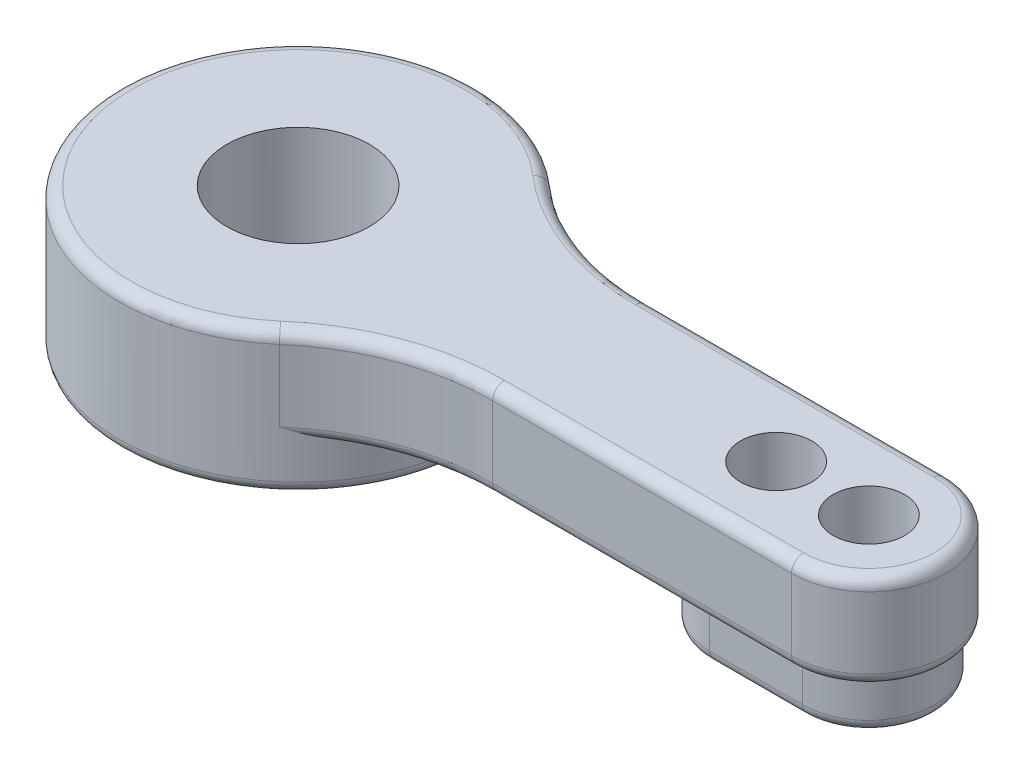
ISO-10303-21;
HEADER;
FILE_DESCRIPTION(('STEP AP214'),'2;1');
FILE_NAME('part.step','',(''),(''),'','','');
FILE_SCHEMA(('AUTOMOTIVE_DESIGN { 1 0 10303 214 1 1 1 1 }'));
ENDSEC;
DATA;
#1=APPLICATION_CONTEXT('core data for automotive mechanical design processes');
#2=APPLICATION_PROTOCOL_DEFINITION('international standard','automotive_design',2000,#1);
#3=PRODUCT_CONTEXT('',#1,'mechanical');
#4=PRODUCT('Part','Part','',(#3));
#5=PRODUCT_RELATED_PRODUCT_CATEGORY('part','',(#4));
#6=PRODUCT_DEFINITION_FORMATION('','',#4);
#7=PRODUCT_DEFINITION_CONTEXT('part definition',#1,'design');
#8=PRODUCT_DEFINITION('design','',#6,#7);
#9=PRODUCT_DEFINITION_SHAPE('','',#8);
#10=(LENGTH_UNIT() NAMED_UNIT(*) SI_UNIT(.MILLI.,.METRE.));
#11=(NAMED_UNIT(*) PLANE_ANGLE_UNIT() SI_UNIT($,.RADIAN.));
#12=(NAMED_UNIT(*) SI_UNIT($,.STERADIAN.) SOLID_ANGLE_UNIT());
#13=UNCERTAINTY_MEASURE_WITH_UNIT(LENGTH_MEASURE(1.E-05),#10,'distance_accuracy_value','');
#14=(GEOMETRIC_REPRESENTATION_CONTEXT(3) GLOBAL_UNCERTAINTY_ASSIGNED_CONTEXT((#13)) GLOBAL_UNIT_ASSIGNED_CONTEXT((#10,
#11,#12)) REPRESENTATION_CONTEXT('',''));
#15=CARTESIAN_POINT('',(0.,0.,0.));
#16=DIRECTION('',(0.,0.,1.));
#17=DIRECTION('',(1.,0.,0.));
#18=AXIS2_PLACEMENT_3D('',#15,#16,#17);
#19=CARTESIAN_POINT('',(0.,2.,0.));
#20=DIRECTION('',(0.,1.,0.));
#21=DIRECTION('',(0.,0.,1.));
#22=AXIS2_PLACEMENT_3D('',#19,#20,#21);
#23=PLANE('',#22);
#24=CARTESIAN_POINT('',(11.4318633651737,2.,-13.25));
#25=DIRECTION('',(0.,1.,0.));
#26=DIRECTION('',(0.,0.,1.));
#27=AXIS2_PLACEMENT_3D('',#24,#25,#26);
#28=CIRCLE('',#27,10.5);
#29=CARTESIAN_POINT('',(6.27940030121434,2.,-4.10111348990847));
#30=VERTEX_POINT('',#29);
#31=CARTESIAN_POINT('',(11.4318633651737,2.,-2.75));
#32=VERTEX_POINT('',#31);
#33=EDGE_CURVE('E223',#30,#32,#28,.T.);
#34=ORIENTED_EDGE('',*,*,#33,.T.);
#35=DIRECTION('',(-1.,0.,0.));
#36=VECTOR('',#35,1.);
#37=CARTESIAN_POINT('',(24.,2.,-2.75));
#38=LINE('',#37,#36);
#39=CARTESIAN_POINT('',(19.5732173123574,2.,-2.75));
#40=VERTEX_POINT('',#39);
#41=EDGE_CURVE('E180',#32,#40,#38,.F.);
#42=ORIENTED_EDGE('',*,*,#41,.T.);
#43=CARTESIAN_POINT('',(20.1,2.,0.));
#44=DIRECTION('',(0.,-1.,0.));
#45=DIRECTION('',(0.,0.,-1.));
#46=AXIS2_PLACEMENT_3D('',#43,#44,#45);
#47=CIRCLE('',#46,2.8);
#48=CARTESIAN_POINT('',(19.5732173123574,2.,2.75));
#49=VERTEX_POINT('',#48);
#50=EDGE_CURVE('E387',#49,#40,#47,.T.);
#51=ORIENTED_EDGE('',*,*,#50,.F.);
#52=DIRECTION('',(1.,0.,0.));
#53=VECTOR('',#52,1.);
#54=CARTESIAN_POINT('',(11.4318633651737,2.,2.75));
#55=LINE('',#54,#53);
#56=CARTESIAN_POINT('',(11.4318633651737,2.,2.75));
#57=VERTEX_POINT('',#56);
#58=EDGE_CURVE('E221',#49,#57,#55,.F.);
#59=ORIENTED_EDGE('',*,*,#58,.T.);
#60=CARTESIAN_POINT('',(11.4318633651737,2.,13.25));
#61=DIRECTION('',(0.,1.,0.));
#62=DIRECTION('',(0.,0.,1.));
#63=AXIS2_PLACEMENT_3D('',#60,#61,#62);
#64=CIRCLE('',#63,10.5);
#65=CARTESIAN_POINT('',(6.27940030121434,2.,4.10111348990847));
#66=VERTEX_POINT('',#65);
#67=EDGE_CURVE('E205',#57,#66,#64,.T.);
#68=ORIENTED_EDGE('',*,*,#67,.T.);
#69=CARTESIAN_POINT('',(0.,2.,0.));
#70=DIRECTION('',(0.,1.,0.));
#71=DIRECTION('',(0.,0.,1.));
#72=AXIS2_PLACEMENT_3D('',#69,#70,#71);
#73=CIRCLE('',#72,7.5);
#74=EDGE_CURVE('E398',#66,#30,#73,.T.);
#75=ORIENTED_EDGE('',*,*,#74,.T.);
#76=EDGE_LOOP('',(#34,#42,#51,#59,#68,#75));
#77=FACE_BOUND('',#76,.T.);
#78=ADVANCED_FACE('F35',(#77),#23,.F.);
#79=CARTESIAN_POINT('',(0.,6.,0.));
#80=DIRECTION('',(0.,-1.,0.));
#81=DIRECTION('',(0.,0.,-1.));
#82=AXIS2_PLACEMENT_3D('',#79,#80,#81);
#83=CYLINDRICAL_SURFACE('',#82,7.5);
#84=CARTESIAN_POINT('',(0.,0.5,0.));
#85=DIRECTION('',(0.,1.,0.));
#86=DIRECTION('',(0.,0.,1.));
#87=AXIS2_PLACEMENT_3D('',#84,#85,#86);
#88=CIRCLE('',#87,7.5);
#89=CARTESIAN_POINT('',(0.,0.5,7.5));
#90=VERTEX_POINT('',#89);
#91=EDGE_CURVE('E263',#90,#90,#88,.T.);
#92=ORIENTED_EDGE('',*,*,#91,.T.);
#93=EDGE_LOOP('',(#92));
#94=FACE_BOUND('',#93,.T.);
#95=DIRECTION('',(0.,-1.,0.));
#96=VECTOR('',#95,1.);
#97=CARTESIAN_POINT('',(4.89937001364586,6.,5.67857142857143));
#98=LINE('',#97,#96);
#99=CARTESIAN_POINT('',(4.89937001364586,2.5,5.67857142857143));
#100=VERTEX_POINT('',#99);
#101=CARTESIAN_POINT('',(4.89937001364586,5.5,5.67857142857143));
#102=VERTEX_POINT('',#101);
#103=EDGE_CURVE('E215',#100,#102,#98,.F.);
#104=ORIENTED_EDGE('',*,*,#103,.T.);
#105=CARTESIAN_POINT('',(0.,5.5,0.));
#106=DIRECTION('',(0.,1.,0.));
#107=DIRECTION('',(0.,0.,1.));
#108=AXIS2_PLACEMENT_3D('',#105,#106,#107);
#109=CIRCLE('',#108,7.5);
#110=CARTESIAN_POINT('',(4.89937001364586,5.5,-5.67857142857143));
#111=VERTEX_POINT('',#110);
#112=EDGE_CURVE('E266',#102,#111,#109,.F.);
#113=ORIENTED_EDGE('',*,*,#112,.T.);
#114=DIRECTION('',(0.,-1.,0.));
#115=VECTOR('',#114,1.);
#116=CARTESIAN_POINT('',(4.89937001364586,6.,-5.67857142857143));
#117=LINE('',#116,#115);
#118=CARTESIAN_POINT('',(4.89937001364586,2.5,-5.67857142857143));
#119=VERTEX_POINT('',#118);
#120=EDGE_CURVE('E211',#111,#119,#117,.T.);
#121=ORIENTED_EDGE('',*,*,#120,.T.);
#122=CARTESIAN_POINT('',(6.27940030121434,2.,-4.10111348990847));
#123=CARTESIAN_POINT('',(6.25723377122052,2.00000782456114,-4.13505467755479));
#124=CARTESIAN_POINT('',(6.23479981914706,2.00104754024722,-4.16880219382619));
#125=CARTESIAN_POINT('',(6.18944923163053,2.00493505579493,-4.23584149444576));
#126=CARTESIAN_POINT('',(6.16653286527585,2.00778187221623,-4.26913351661725));
#127=CARTESIAN_POINT('',(6.09721381699083,2.0186341910087,-4.36811882215584));
#128=CARTESIAN_POINT('',(6.05013346294917,2.02895408772651,-4.43308616706142));
#129=CARTESIAN_POINT('',(5.95470042062543,2.05419953593821,-4.56046505660428));
#130=CARTESIAN_POINT('',(5.90635758043871,2.06909575422026,-4.62289009045097));
#131=CARTESIAN_POINT('',(5.80818784316596,2.10244838021266,-4.74564370735154));
#132=CARTESIAN_POINT('',(5.75835992831014,2.12090727929871,-4.80597078826463));
#133=CARTESIAN_POINT('',(5.64552802746641,2.16514619530997,-4.93834398126179));
#134=CARTESIAN_POINT('',(5.58216046845735,2.19162974593726,-5.00984333760254));
#135=CARTESIAN_POINT('',(5.45332639431899,2.24744273517653,-5.14978410148016));
#136=CARTESIAN_POINT('',(5.38785924609357,2.2767730376853,-5.21822457148387));
#137=CARTESIAN_POINT('',(5.18815081579567,2.36751572822771,-5.41930302563903));
#138=CARTESIAN_POINT('',(5.05070000162154,2.431638226703,-5.54758412211042));
#139=CARTESIAN_POINT('',(4.90562186567096,2.49717864971323,-5.67317292140947));
#140=CARTESIAN_POINT('',(4.90249703074354,2.49858934228894,-5.67587347820163));
#141=CARTESIAN_POINT('',(4.89937001364586,2.5,-5.67857142857143));
#142=B_SPLINE_CURVE_WITH_KNOTS('',3,(#122,#123,#124,#125,#126,#127,#128,#129,#130,#131,#132,
#133,#134,#135,#136,#137,#138,#139,#140,#141),.UNSPECIFIED.,.F.,.F.,(4,2,2,2,2,2,2,2,2,4),(0.,
0.121576259864598,0.243086413500453,0.485518045605545,0.726427068848828,0.967505173719165,
1.26478671263421,1.56215875061039,2.15736827350903,2.17046135092412),.UNSPECIFIED.);
#143=EDGE_CURVE('E45',#119,#30,#142,.F.);
#144=ORIENTED_EDGE('',*,*,#143,.T.);
#145=ORIENTED_EDGE('',*,*,#74,.F.);
#146=CARTESIAN_POINT('',(6.27940030121434,2.,4.10111348990847));
#147=CARTESIAN_POINT('',(6.25723377122052,2.00000782456114,4.13505467755479));
#148=CARTESIAN_POINT('',(6.23479981914706,2.00104754024722,4.16880219382619));
#149=CARTESIAN_POINT('',(6.18944923163053,2.00493505579493,4.23584149444576));
#150=CARTESIAN_POINT('',(6.16653286527585,2.00778187221623,4.26913351661725));
#151=CARTESIAN_POINT('',(6.09721381699083,2.0186341910087,4.36811882215584));
#152=CARTESIAN_POINT('',(6.05013346294917,2.02895408772651,4.43308616706142));
#153=CARTESIAN_POINT('',(5.95470042062543,2.05419953593821,4.56046505660428));
#154=CARTESIAN_POINT('',(5.90635758043871,2.06909575422026,4.62289009045097));
#155=CARTESIAN_POINT('',(5.80818784316596,2.10244838021266,4.74564370735154));
#156=CARTESIAN_POINT('',(5.75835992831014,2.12090727929871,4.80597078826463));
#157=CARTESIAN_POINT('',(5.64552802746641,2.16514619530997,4.93834398126179));
#158=CARTESIAN_POINT('',(5.58216046845735,2.19162974593726,5.00984333760254));
#159=CARTESIAN_POINT('',(5.45332639431899,2.24744273517653,5.14978410148016));
#160=CARTESIAN_POINT('',(5.38785924609357,2.2767730376853,5.21822457148387));
#161=CARTESIAN_POINT('',(5.18815081579567,2.36751572822771,5.41930302563903));
#162=CARTESIAN_POINT('',(5.05070000162154,2.431638226703,5.54758412211042));
#163=CARTESIAN_POINT('',(4.90562186567096,2.49717864971323,5.67317292140947));
#164=CARTESIAN_POINT('',(4.90249703074354,2.49858934228894,5.67587347820163));
#165=CARTESIAN_POINT('',(4.89937001364586,2.5,5.67857142857143));
#166=B_SPLINE_CURVE_WITH_KNOTS('',3,(#146,#147,#148,#149,#150,#151,#152,#153,#154,#155,#156,
#157,#158,#159,#160,#161,#162,#163,#164,#165),.UNSPECIFIED.,.F.,.F.,(4,2,2,2,2,2,2,2,2,4),(0.,
0.121576259864598,0.243086413500453,0.485518045605545,0.726427068848828,0.967505173719165,
1.26478671263421,1.56215875061039,2.15736827350903,2.17046135092412),.UNSPECIFIED.);
#167=EDGE_CURVE('E11',#66,#100,#166,.T.);
#168=ORIENTED_EDGE('',*,*,#167,.T.);
#169=EDGE_LOOP('',(#104,#113,#121,#144,#145,#168));
#170=FACE_BOUND('',#169,.T.);
#171=ADVANCED_FACE('F321',(#94,#170),#83,.T.);
#172=CARTESIAN_POINT('',(0.,6.,0.));
#173=DIRECTION('',(0.,1.,0.));
#174=DIRECTION('',(0.,0.,1.));
#175=AXIS2_PLACEMENT_3D('',#172,#173,#174);
#176=PLANE('',#175);
#177=DIRECTION('',(-1.,0.,0.));
#178=VECTOR('',#177,1.);
#179=CARTESIAN_POINT('',(0.,6.,-2.75));
#180=LINE('',#179,#178);
#181=CARTESIAN_POINT('',(24.,6.,-2.75));
#182=VERTEX_POINT('',#181);
#183=CARTESIAN_POINT('',(11.4318633651737,6.,-2.75));
#184=VERTEX_POINT('',#183);
#185=EDGE_CURVE('E256',#182,#184,#180,.T.);
#186=ORIENTED_EDGE('',*,*,#185,.T.);
#187=CARTESIAN_POINT('',(11.4318633651737,6.,-13.25));
#188=DIRECTION('',(0.,1.,0.));
#189=DIRECTION('',(0.,0.,1.));
#190=AXIS2_PLACEMENT_3D('',#187,#188,#189);
#191=CIRCLE('',#190,10.5);
#192=CARTESIAN_POINT('',(4.57274534606947,6.,-5.3));
#193=VERTEX_POINT('',#192);
#194=EDGE_CURVE('E261',#184,#193,#191,.F.);
#195=ORIENTED_EDGE('',*,*,#194,.T.);
#196=CARTESIAN_POINT('',(0.,6.,0.));
#197=DIRECTION('',(0.,1.,0.));
#198=DIRECTION('',(0.,0.,1.));
#199=AXIS2_PLACEMENT_3D('',#196,#197,#198);
#200=CIRCLE('',#199,7.);
#201=CARTESIAN_POINT('',(4.57274534606947,6.,5.3));
#202=VERTEX_POINT('',#201);
#203=EDGE_CURVE('E258',#193,#202,#200,.T.);
#204=ORIENTED_EDGE('',*,*,#203,.T.);
#205=CARTESIAN_POINT('',(11.4318633651737,6.,13.25));
#206=DIRECTION('',(0.,1.,0.));
#207=DIRECTION('',(0.,0.,1.));
#208=AXIS2_PLACEMENT_3D('',#205,#206,#207);
#209=CIRCLE('',#208,10.5);
#210=CARTESIAN_POINT('',(11.4318633651737,6.,2.75));
#211=VERTEX_POINT('',#210);
#212=EDGE_CURVE('E252',#202,#211,#209,.F.);
#213=ORIENTED_EDGE('',*,*,#212,.T.);
#214=DIRECTION('',(1.,0.,0.));
#215=VECTOR('',#214,1.);
#216=CARTESIAN_POINT('',(0.,6.,2.75));
#217=LINE('',#216,#215);
#218=CARTESIAN_POINT('',(24.,6.,2.75));
#219=VERTEX_POINT('',#218);
#220=EDGE_CURVE('E250',#211,#219,#217,.T.);
#221=ORIENTED_EDGE('',*,*,#220,.T.);
#222=CARTESIAN_POINT('',(24.,6.,0.));
#223=DIRECTION('',(0.,1.,0.));
#224=DIRECTION('',(0.,0.,1.));
#225=AXIS2_PLACEMENT_3D('',#222,#223,#224);
#226=CIRCLE('',#225,2.75);
#227=EDGE_CURVE('E254',#219,#182,#226,.T.);
#228=ORIENTED_EDGE('',*,*,#227,.T.);
#229=EDGE_LOOP('',(#186,#195,#204,#213,#221,#228));
#230=FACE_BOUND('',#229,.T.);
#231=CARTESIAN_POINT('',(24.,6.,0.));
#232=DIRECTION('',(0.,-1.,0.));
#233=DIRECTION('',(0.,0.,-1.));
#234=AXIS2_PLACEMENT_3D('',#231,#232,#233);
#235=CIRCLE('',#234,1.5);
#236=CARTESIAN_POINT('',(24.,6.,-1.5));
#237=VERTEX_POINT('',#236);
#238=EDGE_CURVE('E371',#237,#237,#235,.T.);
#239=ORIENTED_EDGE('',*,*,#238,.T.);
#240=EDGE_LOOP('',(#239));
#241=FACE_BOUND('',#240,.T.);
#242=CARTESIAN_POINT('',(20.1,6.,0.));
#243=DIRECTION('',(0.,-1.,0.));
#244=DIRECTION('',(0.,0.,-1.));
#245=AXIS2_PLACEMENT_3D('',#242,#243,#244);
#246=CIRCLE('',#245,1.5);
#247=CARTESIAN_POINT('',(20.1,6.,-1.5));
#248=VERTEX_POINT('',#247);
#249=EDGE_CURVE('E375',#248,#248,#246,.T.);
#250=ORIENTED_EDGE('',*,*,#249,.T.);
#251=EDGE_LOOP('',(#250));
#252=FACE_BOUND('',#251,.T.);
#253=CARTESIAN_POINT('',(0.,6.,0.));
#254=DIRECTION('',(0.,-1.,0.));
#255=DIRECTION('',(0.,0.,-1.));
#256=AXIS2_PLACEMENT_3D('',#253,#254,#255);
#257=CIRCLE('',#256,3.);
#258=CARTESIAN_POINT('',(0.,6.,-3.));
#259=VERTEX_POINT('',#258);
#260=EDGE_CURVE('E378',#259,#259,#257,.T.);
#261=ORIENTED_EDGE('',*,*,#260,.T.);
#262=EDGE_LOOP('',(#261));
#263=FACE_BOUND('',#262,.T.);
#264=ADVANCED_FACE('F325',(#230,#241,#252,#263),#176,.T.);
#265=CARTESIAN_POINT('',(0.,0.,0.));
#266=DIRECTION('',(0.,1.,0.));
#267=DIRECTION('',(0.,0.,1.));
#268=AXIS2_PLACEMENT_3D('',#265,#266,#267);
#269=PLANE('',#268);
#270=CARTESIAN_POINT('',(0.,0.,0.));
#271=DIRECTION('',(0.,1.,0.));
#272=DIRECTION('',(0.,0.,1.));
#273=AXIS2_PLACEMENT_3D('',#270,#271,#272);
#274=CIRCLE('',#273,7.);
#275=CARTESIAN_POINT('',(0.,0.,7.));
#276=VERTEX_POINT('',#275);
#277=EDGE_CURVE('E272',#276,#276,#274,.F.);
#278=ORIENTED_EDGE('',*,*,#277,.T.);
#279=EDGE_LOOP('',(#278));
#280=FACE_BOUND('',#279,.T.);
#281=CARTESIAN_POINT('',(0.,0.,0.));
#282=DIRECTION('',(0.,1.,0.));
#283=DIRECTION('',(0.,0.,1.));
#284=AXIS2_PLACEMENT_3D('',#281,#282,#283);
#285=CIRCLE('',#284,3.);
#286=CARTESIAN_POINT('',(0.,0.,3.));
#287=VERTEX_POINT('',#286);
#288=EDGE_CURVE('E390',#287,#287,#285,.T.);
#289=ORIENTED_EDGE('',*,*,#288,.T.);
#290=EDGE_LOOP('',(#289));
#291=FACE_BOUND('',#290,.T.);
#292=ADVANCED_FACE('F327',(#280,#291),#269,.F.);
#293=CARTESIAN_POINT('',(0.,2.,-3.25));
#294=DIRECTION('',(0.,0.,-1.));
#295=DIRECTION('',(-1.,0.,0.));
#296=AXIS2_PLACEMENT_3D('',#293,#294,#295);
#297=PLANE('',#296);
#298=DIRECTION('',(0.,1.,0.));
#299=VECTOR('',#298,1.);
#300=CARTESIAN_POINT('',(24.,2.,-3.25));
#301=LINE('',#300,#299);
#302=CARTESIAN_POINT('',(24.,2.5,-3.25));
#303=VERTEX_POINT('',#302);
#304=CARTESIAN_POINT('',(24.,5.5,-3.25));
#305=VERTEX_POINT('',#304);
#306=EDGE_CURVE('E203',#303,#305,#301,.T.);
#307=ORIENTED_EDGE('',*,*,#306,.F.);
#308=DIRECTION('',(-1.,0.,0.));
#309=VECTOR('',#308,1.);
#310=CARTESIAN_POINT('',(11.4318633651737,2.5,-3.25));
#311=LINE('',#310,#309);
#312=CARTESIAN_POINT('',(11.4318633651737,2.5,-3.25));
#313=VERTEX_POINT('',#312);
#314=EDGE_CURVE('E179',#303,#313,#311,.T.);
#315=ORIENTED_EDGE('',*,*,#314,.T.);
#316=DIRECTION('',(0.,-1.,0.));
#317=VECTOR('',#316,1.);
#318=CARTESIAN_POINT('',(11.4318633651737,2.,-3.25));
#319=LINE('',#318,#317);
#320=CARTESIAN_POINT('',(11.4318633651737,5.5,-3.25));
#321=VERTEX_POINT('',#320);
#322=EDGE_CURVE('E200',#313,#321,#319,.F.);
#323=ORIENTED_EDGE('',*,*,#322,.T.);
#324=DIRECTION('',(-1.,0.,0.));
#325=VECTOR('',#324,1.);
#326=CARTESIAN_POINT('',(0.,5.5,-3.25));
#327=LINE('',#326,#325);
#328=EDGE_CURVE('E206',#321,#305,#327,.F.);
#329=ORIENTED_EDGE('',*,*,#328,.T.);
#330=EDGE_LOOP('',(#307,#315,#323,#329));
#331=FACE_BOUND('',#330,.T.);
#332=ADVANCED_FACE('F199',(#331),#297,.T.);
#333=CARTESIAN_POINT('',(0.,2.,3.25));
#334=DIRECTION('',(0.,0.,1.));
#335=DIRECTION('',(1.,0.,0.));
#336=AXIS2_PLACEMENT_3D('',#333,#334,#335);
#337=PLANE('',#336);
#338=DIRECTION('',(0.,-1.,0.));
#339=VECTOR('',#338,1.);
#340=CARTESIAN_POINT('',(11.4318633651737,2.,3.25));
#341=LINE('',#340,#339);
#342=CARTESIAN_POINT('',(11.4318633651737,5.5,3.25));
#343=VERTEX_POINT('',#342);
#344=CARTESIAN_POINT('',(11.4318633651737,2.5,3.25));
#345=VERTEX_POINT('',#344);
#346=EDGE_CURVE('E210',#343,#345,#341,.T.);
#347=ORIENTED_EDGE('',*,*,#346,.T.);
#348=DIRECTION('',(1.,0.,0.));
#349=VECTOR('',#348,1.);
#350=CARTESIAN_POINT('',(24.,2.5,3.25));
#351=LINE('',#350,#349);
#352=CARTESIAN_POINT('',(24.,2.5,3.25));
#353=VERTEX_POINT('',#352);
#354=EDGE_CURVE('E228',#345,#353,#351,.T.);
#355=ORIENTED_EDGE('',*,*,#354,.T.);
#356=DIRECTION('',(0.,1.,0.));
#357=VECTOR('',#356,1.);
#358=CARTESIAN_POINT('',(24.,2.,3.25));
#359=LINE('',#358,#357);
#360=CARTESIAN_POINT('',(24.,5.5,3.25));
#361=VERTEX_POINT('',#360);
#362=EDGE_CURVE('E396',#353,#361,#359,.T.);
#363=ORIENTED_EDGE('',*,*,#362,.T.);
#364=DIRECTION('',(1.,0.,0.));
#365=VECTOR('',#364,1.);
#366=CARTESIAN_POINT('',(0.,5.5,3.25));
#367=LINE('',#366,#365);
#368=EDGE_CURVE('E226',#361,#343,#367,.F.);
#369=ORIENTED_EDGE('',*,*,#368,.T.);
#370=EDGE_LOOP('',(#347,#355,#363,#369));
#371=FACE_BOUND('',#370,.T.);
#372=ADVANCED_FACE('F352',(#371),#337,.T.);
#373=CARTESIAN_POINT('',(24.,2.,0.));
#374=DIRECTION('',(0.,1.,0.));
#375=DIRECTION('',(0.,0.,1.));
#376=AXIS2_PLACEMENT_3D('',#373,#374,#375);
#377=CYLINDRICAL_SURFACE('',#376,3.25);
#378=ORIENTED_EDGE('',*,*,#362,.F.);
#379=CARTESIAN_POINT('',(24.,2.5,0.));
#380=DIRECTION('',(0.,1.,0.));
#381=DIRECTION('',(0.,0.,1.));
#382=AXIS2_PLACEMENT_3D('',#379,#380,#381);
#383=CIRCLE('',#382,3.25);
#384=EDGE_CURVE('E232',#353,#303,#383,.T.);
#385=ORIENTED_EDGE('',*,*,#384,.T.);
#386=ORIENTED_EDGE('',*,*,#306,.T.);
#387=CARTESIAN_POINT('',(24.,5.5,0.));
#388=DIRECTION('',(0.,1.,0.));
#389=DIRECTION('',(0.,0.,1.));
#390=AXIS2_PLACEMENT_3D('',#387,#388,#389);
#391=CIRCLE('',#390,3.25);
#392=EDGE_CURVE('E230',#305,#361,#391,.F.);
#393=ORIENTED_EDGE('',*,*,#392,.T.);
#394=EDGE_LOOP('',(#378,#385,#386,#393));
#395=FACE_BOUND('',#394,.T.);
#396=ADVANCED_FACE('F353',(#395),#377,.T.);
#397=CARTESIAN_POINT('',(24.,0.,0.));
#398=DIRECTION('',(0.,1.,0.));
#399=DIRECTION('',(0.,0.,1.));
#400=AXIS2_PLACEMENT_3D('',#397,#398,#399);
#401=CYLINDRICAL_SURFACE('',#400,2.8);
#402=DIRECTION('',(0.,1.,0.));
#403=VECTOR('',#402,1.);
#404=CARTESIAN_POINT('',(24.,0.,2.8));
#405=LINE('',#404,#403);
#406=CARTESIAN_POINT('',(24.,0.5,2.8));
#407=VERTEX_POINT('',#406);
#408=CARTESIAN_POINT('',(24.,2.00250628144669,2.8));
#409=VERTEX_POINT('',#408);
#410=EDGE_CURVE('E394',#407,#409,#405,.T.);
#411=ORIENTED_EDGE('',*,*,#410,.F.);
#412=CARTESIAN_POINT('',(24.,0.5,0.));
#413=DIRECTION('',(0.,-1.,0.));
#414=DIRECTION('',(0.,0.,-1.));
#415=AXIS2_PLACEMENT_3D('',#412,#413,#414);
#416=CIRCLE('',#415,2.8);
#417=CARTESIAN_POINT('',(24.,0.5,-2.8));
#418=VERTEX_POINT('',#417);
#419=EDGE_CURVE('E246',#407,#418,#416,.F.);
#420=ORIENTED_EDGE('',*,*,#419,.T.);
#421=DIRECTION('',(0.,1.,0.));
#422=VECTOR('',#421,1.);
#423=CARTESIAN_POINT('',(24.,0.,-2.8));
#424=LINE('',#423,#422);
#425=CARTESIAN_POINT('',(24.,2.00250628144669,-2.8));
#426=VERTEX_POINT('',#425);
#427=EDGE_CURVE('E65',#418,#426,#424,.T.);
#428=ORIENTED_EDGE('',*,*,#427,.T.);
#429=CARTESIAN_POINT('',(24.,2.00250628144669,0.));
#430=DIRECTION('',(0.,1.,0.));
#431=DIRECTION('',(0.,0.,1.));
#432=AXIS2_PLACEMENT_3D('',#429,#430,#431);
#433=CIRCLE('',#432,2.8);
#434=EDGE_CURVE('E473',#426,#409,#433,.F.);
#435=ORIENTED_EDGE('',*,*,#434,.T.);
#436=EDGE_LOOP('',(#411,#420,#428,#435));
#437=FACE_BOUND('',#436,.T.);
#438=ADVANCED_FACE('F349',(#437),#401,.T.);
#439=CARTESIAN_POINT('',(24.,0.,2.8));
#440=DIRECTION('',(0.,0.,-1.));
#441=DIRECTION('',(-1.,0.,0.));
#442=AXIS2_PLACEMENT_3D('',#439,#440,#441);
#443=PLANE('',#442);
#444=DIRECTION('',(0.,1.,0.));
#445=VECTOR('',#444,1.);
#446=CARTESIAN_POINT('',(20.1,0.,2.8));
#447=LINE('',#446,#445);
#448=CARTESIAN_POINT('',(20.1,0.5,2.8));
#449=VERTEX_POINT('',#448);
#450=CARTESIAN_POINT('',(20.1,2.00250628144669,2.8));
#451=VERTEX_POINT('',#450);
#452=EDGE_CURVE('E53',#449,#451,#447,.T.);
#453=ORIENTED_EDGE('',*,*,#452,.F.);
#454=DIRECTION('',(-1.,0.,0.));
#455=VECTOR('',#454,1.);
#456=CARTESIAN_POINT('',(24.,0.5,2.8));
#457=LINE('',#456,#455);
#458=EDGE_CURVE('E243',#449,#407,#457,.F.);
#459=ORIENTED_EDGE('',*,*,#458,.T.);
#460=ORIENTED_EDGE('',*,*,#410,.T.);
#461=DIRECTION('',(-1.,0.,0.));
#462=VECTOR('',#461,1.);
#463=CARTESIAN_POINT('',(0.,2.00250628144669,2.8));
#464=LINE('',#463,#462);
#465=EDGE_CURVE('E474',#409,#451,#464,.T.);
#466=ORIENTED_EDGE('',*,*,#465,.T.);
#467=EDGE_LOOP('',(#453,#459,#460,#466));
#468=FACE_BOUND('',#467,.T.);
#469=ADVANCED_FACE('F677',(#468),#443,.F.);
#470=CARTESIAN_POINT('',(20.1,0.,0.));
#471=DIRECTION('',(0.,1.,0.));
#472=DIRECTION('',(0.,0.,1.));
#473=AXIS2_PLACEMENT_3D('',#470,#471,#472);
#474=CYLINDRICAL_SURFACE('',#473,2.8);
#475=DIRECTION('',(0.,1.,0.));
#476=VECTOR('',#475,1.);
#477=CARTESIAN_POINT('',(20.1,0.,-2.8));
#478=LINE('',#477,#476);
#479=CARTESIAN_POINT('',(20.1,0.5,-2.8));
#480=VERTEX_POINT('',#479);
#481=CARTESIAN_POINT('',(20.1,2.00250628144669,-2.8));
#482=VERTEX_POINT('',#481);
#483=EDGE_CURVE('E72',#480,#482,#478,.T.);
#484=ORIENTED_EDGE('',*,*,#483,.F.);
#485=CARTESIAN_POINT('',(20.1,0.5,0.));
#486=DIRECTION('',(0.,-1.,0.));
#487=DIRECTION('',(0.,0.,-1.));
#488=AXIS2_PLACEMENT_3D('',#485,#486,#487);
#489=CIRCLE('',#488,2.8);
#490=EDGE_CURVE('E275',#480,#449,#489,.F.);
#491=ORIENTED_EDGE('',*,*,#490,.T.);
#492=ORIENTED_EDGE('',*,*,#452,.T.);
#493=CARTESIAN_POINT('',(20.1,2.00250628144669,2.8));
#494=CARTESIAN_POINT('',(20.0605273098205,2.00251320547436,2.80000012031858));
#495=CARTESIAN_POINT('',(20.0210589691369,2.00242162093721,2.79916523370932));
#496=CARTESIAN_POINT('',(19.942195484784,2.00210048014614,2.79582820206988));
#497=CARTESIAN_POINT('',(19.9028003372984,2.0018709313005,2.79332614656114));
#498=CARTESIAN_POINT('',(19.7854038388822,2.00106790483025,2.78337314210275));
#499=CARTESIAN_POINT('',(19.7075986717161,2.00037837454436,2.77347508934333));
#500=CARTESIAN_POINT('',(19.5530784452561,1.99983503729572,2.74718361423967));
#501=CARTESIAN_POINT('',(19.476363431827,1.99998126539119,2.73078991944443));
#502=CARTESIAN_POINT('',(19.3622920456543,2.00227446052725,2.70135986058976));
#503=CARTESIAN_POINT('',(19.3242950515098,2.00339261121849,2.69069423149586));
#504=CARTESIAN_POINT('',(19.2488144187992,2.00667306944443,2.66777823793601));
#505=CARTESIAN_POINT('',(19.2113309681647,2.00883574925505,2.65552730960119));
#506=CARTESIAN_POINT('',(19.174156686257,2.01169264625592,2.64250149638507));
#507=B_SPLINE_CURVE_WITH_KNOTS('',3,(#493,#494,#495,#496,#497,#498,#499,#500,#501,#502,#503,
#504,#505,#506),.UNSPECIFIED.,.F.,.F.,(4,2,2,2,2,2,4),(0.,0.118400552395828,0.236794747587691,
0.471810676962812,0.706836464809551,0.825237394891478,0.943680554891164),.UNSPECIFIED.);
#508=EDGE_CURVE('E310',#451,#49,#507,.T.);
#509=ORIENTED_EDGE('',*,*,#508,.T.);
#510=ORIENTED_EDGE('',*,*,#50,.T.);
#511=CARTESIAN_POINT('',(19.5732173123574,2.,-2.75));
#512=CARTESIAN_POINT('',(19.6119650912237,2.00000624673782,-2.7574224493602));
#513=CARTESIAN_POINT('',(19.6508646545702,2.00016443845236,-2.76402482810073));
#514=CARTESIAN_POINT('',(19.7289073082153,2.00062015591522,-2.77558038950895));
#515=CARTESIAN_POINT('',(19.7680503988317,2.00091768184539,-2.78053357002421));
#516=CARTESIAN_POINT('',(19.8851820879372,2.00176826697491,-2.79284551286858));
#517=CARTESIAN_POINT('',(19.9634404279816,2.00228422563194,-2.79776510020806));
#518=CARTESIAN_POINT('',(20.120097531168,2.00260735664962,-2.80102375034137));
#519=CARTESIAN_POINT('',(20.1984962969471,2.00241451555637,-2.79936268822624));
#520=CARTESIAN_POINT('',(20.3160417152819,2.00175682562131,-2.7919318756157));
#521=CARTESIAN_POINT('',(20.3553574104271,2.00147448674639,-2.78861057250213));
#522=CARTESIAN_POINT('',(20.4338130213326,2.00090337441478,-2.7803101669541));
#523=CARTESIAN_POINT('',(20.4729529386269,2.00061460101437,-2.77533107901531));
#524=CARTESIAN_POINT('',(20.5119748823308,2.00038142730687,-2.76952643900153));
#525=B_SPLINE_CURVE_WITH_KNOTS('',3,(#511,#512,#513,#514,#515,#516,#517,#518,#519,#520,#521,
#522,#523,#524),.UNSPECIFIED.,.F.,.F.,(4,2,2,2,2,2,4),(0.,0.118337945968026,0.236676046382285,
0.471625023229342,0.706578459723126,0.824917853956475,0.943256213457199),.UNSPECIFIED.);
#526=EDGE_CURVE('E277',#40,#482,#525,.T.);
#527=ORIENTED_EDGE('',*,*,#526,.T.);
#528=EDGE_LOOP('',(#484,#491,#492,#509,#510,#527));
#529=FACE_BOUND('',#528,.T.);
#530=ADVANCED_FACE('F287',(#529),#474,.T.);
#531=CARTESIAN_POINT('',(24.,0.,-2.8));
#532=DIRECTION('',(0.,0.,1.));
#533=DIRECTION('',(1.,0.,0.));
#534=AXIS2_PLACEMENT_3D('',#531,#532,#533);
#535=PLANE('',#534);
#536=ORIENTED_EDGE('',*,*,#427,.F.);
#537=DIRECTION('',(1.,0.,0.));
#538=VECTOR('',#537,1.);
#539=CARTESIAN_POINT('',(20.1,0.5,-2.8));
#540=LINE('',#539,#538);
#541=EDGE_CURVE('E248',#418,#480,#540,.F.);
#542=ORIENTED_EDGE('',*,*,#541,.T.);
#543=ORIENTED_EDGE('',*,*,#483,.T.);
#544=DIRECTION('',(1.,0.,0.));
#545=VECTOR('',#544,1.);
#546=CARTESIAN_POINT('',(0.,2.00250628144669,-2.8));
#547=LINE('',#546,#545);
#548=EDGE_CURVE('E285',#482,#426,#547,.T.);
#549=ORIENTED_EDGE('',*,*,#548,.T.);
#550=EDGE_LOOP('',(#536,#542,#543,#549));
#551=FACE_BOUND('',#550,.T.);
#552=ADVANCED_FACE('F469',(#551),#535,.F.);
#553=CARTESIAN_POINT('',(24.,0.,0.));
#554=DIRECTION('',(0.,-1.,0.));
#555=DIRECTION('',(0.,0.,-1.));
#556=AXIS2_PLACEMENT_3D('',#553,#554,#555);
#557=PLANE('',#556);
#558=CARTESIAN_POINT('',(24.,0.,0.));
#559=DIRECTION('',(0.,-1.,0.));
#560=DIRECTION('',(0.,0.,-1.));
#561=AXIS2_PLACEMENT_3D('',#558,#559,#560);
#562=CIRCLE('',#561,2.3);
#563=CARTESIAN_POINT('',(24.,0.,-2.3));
#564=VERTEX_POINT('',#563);
#565=CARTESIAN_POINT('',(24.,0.,2.3));
#566=VERTEX_POINT('',#565);
#567=EDGE_CURVE('E238',#564,#566,#562,.T.);
#568=ORIENTED_EDGE('',*,*,#567,.T.);
#569=DIRECTION('',(-1.,0.,0.));
#570=VECTOR('',#569,1.);
#571=CARTESIAN_POINT('',(20.1,0.,2.3));
#572=LINE('',#571,#570);
#573=CARTESIAN_POINT('',(20.1,0.,2.3));
#574=VERTEX_POINT('',#573);
#575=EDGE_CURVE('E240',#566,#574,#572,.T.);
#576=ORIENTED_EDGE('',*,*,#575,.T.);
#577=CARTESIAN_POINT('',(20.1,0.,0.));
#578=DIRECTION('',(0.,-1.,0.));
#579=DIRECTION('',(0.,0.,-1.));
#580=AXIS2_PLACEMENT_3D('',#577,#578,#579);
#581=CIRCLE('',#580,2.3);
#582=CARTESIAN_POINT('',(20.1,0.,-2.3));
#583=VERTEX_POINT('',#582);
#584=EDGE_CURVE('E234',#574,#583,#581,.T.);
#585=ORIENTED_EDGE('',*,*,#584,.T.);
#586=DIRECTION('',(1.,0.,0.));
#587=VECTOR('',#586,1.);
#588=CARTESIAN_POINT('',(24.,0.,-2.3));
#589=LINE('',#588,#587);
#590=EDGE_CURVE('E236',#583,#564,#589,.T.);
#591=ORIENTED_EDGE('',*,*,#590,.T.);
#592=EDGE_LOOP('',(#568,#576,#585,#591));
#593=FACE_BOUND('',#592,.T.);
#594=CARTESIAN_POINT('',(24.,0.,0.));
#595=DIRECTION('',(0.,-1.,0.));
#596=DIRECTION('',(0.,0.,-1.));
#597=AXIS2_PLACEMENT_3D('',#594,#595,#596);
#598=CIRCLE('',#597,1.5);
#599=CARTESIAN_POINT('',(24.,0.,-1.5));
#600=VERTEX_POINT('',#599);
#601=EDGE_CURVE('E406',#600,#600,#598,.T.);
#602=ORIENTED_EDGE('',*,*,#601,.F.);
#603=EDGE_LOOP('',(#602));
#604=FACE_BOUND('',#603,.T.);
#605=CARTESIAN_POINT('',(20.1,0.,0.));
#606=DIRECTION('',(0.,-1.,0.));
#607=DIRECTION('',(0.,0.,-1.));
#608=AXIS2_PLACEMENT_3D('',#605,#606,#607);
#609=CIRCLE('',#608,1.5);
#610=CARTESIAN_POINT('',(20.1,0.,-1.5));
#611=VERTEX_POINT('',#610);
#612=EDGE_CURVE('E403',#611,#611,#609,.T.);
#613=ORIENTED_EDGE('',*,*,#612,.F.);
#614=EDGE_LOOP('',(#613));
#615=FACE_BOUND('',#614,.T.);
#616=ADVANCED_FACE('F653',(#593,#604,#615),#557,.T.);
#617=CARTESIAN_POINT('',(20.1,6.,0.));
#618=DIRECTION('',(0.,-1.,0.));
#619=DIRECTION('',(0.,0.,-1.));
#620=AXIS2_PLACEMENT_3D('',#617,#618,#619);
#621=CYLINDRICAL_SURFACE('',#620,1.5);
#622=ORIENTED_EDGE('',*,*,#612,.T.);
#623=EDGE_LOOP('',(#622));
#624=FACE_BOUND('',#623,.T.);
#625=ORIENTED_EDGE('',*,*,#249,.F.);
#626=EDGE_LOOP('',(#625));
#627=FACE_BOUND('',#626,.T.);
#628=ADVANCED_FACE('F645',(#624,#627),#621,.F.);
#629=CARTESIAN_POINT('',(24.,6.,0.));
#630=DIRECTION('',(0.,-1.,0.));
#631=DIRECTION('',(0.,0.,-1.));
#632=AXIS2_PLACEMENT_3D('',#629,#630,#631);
#633=CYLINDRICAL_SURFACE('',#632,1.5);
#634=ORIENTED_EDGE('',*,*,#601,.T.);
#635=EDGE_LOOP('',(#634));
#636=FACE_BOUND('',#635,.T.);
#637=ORIENTED_EDGE('',*,*,#238,.F.);
#638=EDGE_LOOP('',(#637));
#639=FACE_BOUND('',#638,.T.);
#640=ADVANCED_FACE('F338',(#636,#639),#633,.F.);
#641=CARTESIAN_POINT('',(0.,6.,0.));
#642=DIRECTION('',(0.,-1.,0.));
#643=DIRECTION('',(0.,0.,-1.));
#644=AXIS2_PLACEMENT_3D('',#641,#642,#643);
#645=CYLINDRICAL_SURFACE('',#644,3.);
#646=ORIENTED_EDGE('',*,*,#260,.F.);
#647=EDGE_LOOP('',(#646));
#648=FACE_BOUND('',#647,.T.);
#649=ORIENTED_EDGE('',*,*,#288,.F.);
#650=EDGE_LOOP('',(#649));
#651=FACE_BOUND('',#650,.T.);
#652=ADVANCED_FACE('F331',(#648,#651),#645,.F.);
#653=CARTESIAN_POINT('',(11.4318633651737,6.,-13.25));
#654=DIRECTION('',(0.,-1.,0.));
#655=DIRECTION('',(0.,0.,-1.));
#656=AXIS2_PLACEMENT_3D('',#653,#654,#655);
#657=CYLINDRICAL_SURFACE('',#656,10.);
#658=ORIENTED_EDGE('',*,*,#322,.F.);
#659=CARTESIAN_POINT('',(11.4318633651737,2.5,-13.25));
#660=DIRECTION('',(0.,1.,0.));
#661=DIRECTION('',(0.,0.,1.));
#662=AXIS2_PLACEMENT_3D('',#659,#660,#661);
#663=CIRCLE('',#662,10.);
#664=EDGE_CURVE('E187',#313,#119,#663,.F.);
#665=ORIENTED_EDGE('',*,*,#664,.T.);
#666=ORIENTED_EDGE('',*,*,#120,.F.);
#667=CARTESIAN_POINT('',(11.4318633651737,5.5,-13.25));
#668=DIRECTION('',(0.,1.,0.));
#669=DIRECTION('',(0.,0.,1.));
#670=AXIS2_PLACEMENT_3D('',#667,#668,#669);
#671=CIRCLE('',#670,10.);
#672=EDGE_CURVE('E194',#111,#321,#671,.T.);
#673=ORIENTED_EDGE('',*,*,#672,.T.);
#674=EDGE_LOOP('',(#658,#665,#666,#673));
#675=FACE_BOUND('',#674,.T.);
#676=ADVANCED_FACE('F208',(#675),#657,.F.);
#677=CARTESIAN_POINT('',(11.4318633651737,6.,13.25));
#678=DIRECTION('',(0.,-1.,0.));
#679=DIRECTION('',(0.,0.,-1.));
#680=AXIS2_PLACEMENT_3D('',#677,#678,#679);
#681=CYLINDRICAL_SURFACE('',#680,10.);
#682=ORIENTED_EDGE('',*,*,#346,.F.);
#683=CARTESIAN_POINT('',(11.4318633651737,5.5,13.25));
#684=DIRECTION('',(0.,1.,0.));
#685=DIRECTION('',(0.,0.,1.));
#686=AXIS2_PLACEMENT_3D('',#683,#684,#685);
#687=CIRCLE('',#686,10.);
#688=EDGE_CURVE('E80',#343,#102,#687,.T.);
#689=ORIENTED_EDGE('',*,*,#688,.T.);
#690=ORIENTED_EDGE('',*,*,#103,.F.);
#691=CARTESIAN_POINT('',(11.4318633651737,2.5,13.25));
#692=DIRECTION('',(0.,1.,0.));
#693=DIRECTION('',(0.,0.,1.));
#694=AXIS2_PLACEMENT_3D('',#691,#692,#693);
#695=CIRCLE('',#694,10.);
#696=EDGE_CURVE('E193',#100,#345,#695,.F.);
#697=ORIENTED_EDGE('',*,*,#696,.T.);
#698=EDGE_LOOP('',(#682,#689,#690,#697));
#699=FACE_BOUND('',#698,.T.);
#700=ADVANCED_FACE('F296',(#699),#681,.F.);
#701=CARTESIAN_POINT('',(11.4318633651737,2.5,13.25));
#702=DIRECTION('',(0.,1.,0.));
#703=DIRECTION('',(0.,0.,1.));
#704=AXIS2_PLACEMENT_3D('',#701,#702,#703);
#705=TOROIDAL_SURFACE('',#704,10.5,0.5);
#706=ORIENTED_EDGE('',*,*,#167,.F.);
#707=ORIENTED_EDGE('',*,*,#67,.F.);
#708=CARTESIAN_POINT('',(11.4318633651737,2.5,2.75));
#709=DIRECTION('',(1.,0.,0.));
#710=DIRECTION('',(0.,0.,-1.));
#711=AXIS2_PLACEMENT_3D('',#708,#709,#710);
#712=CIRCLE('',#711,0.5);
#713=EDGE_CURVE('E379',#345,#57,#712,.T.);
#714=ORIENTED_EDGE('',*,*,#713,.F.);
#715=ORIENTED_EDGE('',*,*,#696,.F.);
#716=EDGE_LOOP('',(#706,#707,#714,#715));
#717=FACE_BOUND('',#716,.T.);
#718=ADVANCED_FACE('F336',(#717),#705,.T.);
#719=CARTESIAN_POINT('',(0.,2.5,2.75));
#720=DIRECTION('',(-1.,0.,0.));
#721=DIRECTION('',(0.,0.,1.));
#722=AXIS2_PLACEMENT_3D('',#719,#720,#721);
#723=CYLINDRICAL_SURFACE('',#722,0.5);
#724=ORIENTED_EDGE('',*,*,#508,.F.);
#725=ORIENTED_EDGE('',*,*,#465,.F.);
#726=CARTESIAN_POINT('',(24.,2.5,2.75));
#727=DIRECTION('',(1.,0.,0.));
#728=DIRECTION('',(0.,0.,-1.));
#729=AXIS2_PLACEMENT_3D('',#726,#727,#728);
#730=CIRCLE('',#729,0.5);
#731=EDGE_CURVE('E383',#353,#409,#730,.T.);
#732=ORIENTED_EDGE('',*,*,#731,.F.);
#733=ORIENTED_EDGE('',*,*,#354,.F.);
#734=ORIENTED_EDGE('',*,*,#713,.T.);
#735=ORIENTED_EDGE('',*,*,#58,.F.);
#736=EDGE_LOOP('',(#724,#725,#732,#733,#734,#735));
#737=FACE_BOUND('',#736,.T.);
#738=ADVANCED_FACE('F482',(#737),#723,.T.);
#739=CARTESIAN_POINT('',(24.,2.5,0.));
#740=DIRECTION('',(0.,1.,0.));
#741=DIRECTION('',(0.,0.,1.));
#742=AXIS2_PLACEMENT_3D('',#739,#740,#741);
#743=TOROIDAL_SURFACE('',#742,2.75,0.5);
#744=ORIENTED_EDGE('',*,*,#731,.T.);
#745=ORIENTED_EDGE('',*,*,#434,.F.);
#746=CARTESIAN_POINT('',(24.,2.5,-2.75));
#747=DIRECTION('',(-1.,0.,0.));
#748=DIRECTION('',(0.,0.,1.));
#749=AXIS2_PLACEMENT_3D('',#746,#747,#748);
#750=CIRCLE('',#749,0.5);
#751=EDGE_CURVE('E183',#303,#426,#750,.T.);
#752=ORIENTED_EDGE('',*,*,#751,.F.);
#753=ORIENTED_EDGE('',*,*,#384,.F.);
#754=EDGE_LOOP('',(#744,#745,#752,#753));
#755=FACE_BOUND('',#754,.T.);
#756=ADVANCED_FACE('F301',(#755),#743,.T.);
#757=CARTESIAN_POINT('',(11.4318633651737,2.5,-13.25));
#758=DIRECTION('',(0.,1.,0.));
#759=DIRECTION('',(0.,0.,1.));
#760=AXIS2_PLACEMENT_3D('',#757,#758,#759);
#761=TOROIDAL_SURFACE('',#760,10.5,0.5);
#762=ORIENTED_EDGE('',*,*,#143,.F.);
#763=ORIENTED_EDGE('',*,*,#664,.F.);
#764=CARTESIAN_POINT('',(11.4318633651737,2.5,-2.75));
#765=DIRECTION('',(1.,0.,0.));
#766=DIRECTION('',(0.,0.,-1.));
#767=AXIS2_PLACEMENT_3D('',#764,#765,#766);
#768=CIRCLE('',#767,0.5);
#769=EDGE_CURVE('E173',#32,#313,#768,.T.);
#770=ORIENTED_EDGE('',*,*,#769,.F.);
#771=ORIENTED_EDGE('',*,*,#33,.F.);
#772=EDGE_LOOP('',(#762,#763,#770,#771));
#773=FACE_BOUND('',#772,.T.);
#774=ADVANCED_FACE('F188',(#773),#761,.T.);
#775=CARTESIAN_POINT('',(0.,2.5,-2.75));
#776=DIRECTION('',(1.,0.,0.));
#777=DIRECTION('',(0.,0.,-1.));
#778=AXIS2_PLACEMENT_3D('',#775,#776,#777);
#779=CYLINDRICAL_SURFACE('',#778,0.5);
#780=ORIENTED_EDGE('',*,*,#526,.F.);
#781=ORIENTED_EDGE('',*,*,#41,.F.);
#782=ORIENTED_EDGE('',*,*,#769,.T.);
#783=ORIENTED_EDGE('',*,*,#314,.F.);
#784=ORIENTED_EDGE('',*,*,#751,.T.);
#785=ORIENTED_EDGE('',*,*,#548,.F.);
#786=EDGE_LOOP('',(#780,#781,#782,#783,#784,#785));
#787=FACE_BOUND('',#786,.T.);
#788=ADVANCED_FACE('F176',(#787),#779,.T.);
#789=CARTESIAN_POINT('',(24.,0.5,-2.3));
#790=DIRECTION('',(-1.,0.,0.));
#791=DIRECTION('',(0.,0.,1.));
#792=AXIS2_PLACEMENT_3D('',#789,#790,#791);
#793=CYLINDRICAL_SURFACE('',#792,0.5);
#794=CARTESIAN_POINT('',(20.1,0.5,-2.3));
#795=DIRECTION('',(-1.,0.,0.));
#796=DIRECTION('',(0.,0.,1.));
#797=AXIS2_PLACEMENT_3D('',#794,#795,#796);
#798=CIRCLE('',#797,0.5);
#799=EDGE_CURVE('E452',#480,#583,#798,.T.);
#800=ORIENTED_EDGE('',*,*,#799,.F.);
#801=ORIENTED_EDGE('',*,*,#541,.F.);
#802=CARTESIAN_POINT('',(24.,0.5,-2.3));
#803=DIRECTION('',(1.,0.,0.));
#804=DIRECTION('',(0.,0.,-1.));
#805=AXIS2_PLACEMENT_3D('',#802,#803,#804);
#806=CIRCLE('',#805,0.5);
#807=EDGE_CURVE('E184',#564,#418,#806,.T.);
#808=ORIENTED_EDGE('',*,*,#807,.F.);
#809=ORIENTED_EDGE('',*,*,#590,.F.);
#810=EDGE_LOOP('',(#800,#801,#808,#809));
#811=FACE_BOUND('',#810,.T.);
#812=ADVANCED_FACE('F295',(#811),#793,.T.);
#813=CARTESIAN_POINT('',(24.,0.5,0.));
#814=DIRECTION('',(0.,-1.,0.));
#815=DIRECTION('',(0.,0.,-1.));
#816=AXIS2_PLACEMENT_3D('',#813,#814,#815);
#817=TOROIDAL_SURFACE('',#816,2.3,0.5);
#818=ORIENTED_EDGE('',*,*,#807,.T.);
#819=ORIENTED_EDGE('',*,*,#419,.F.);
#820=CARTESIAN_POINT('',(24.,0.5,2.3));
#821=DIRECTION('',(-1.,0.,0.));
#822=DIRECTION('',(0.,0.,1.));
#823=AXIS2_PLACEMENT_3D('',#820,#821,#822);
#824=CIRCLE('',#823,0.5);
#825=EDGE_CURVE('E445',#566,#407,#824,.T.);
#826=ORIENTED_EDGE('',*,*,#825,.F.);
#827=ORIENTED_EDGE('',*,*,#567,.F.);
#828=EDGE_LOOP('',(#818,#819,#826,#827));
#829=FACE_BOUND('',#828,.T.);
#830=ADVANCED_FACE('F464',(#829),#817,.T.);
#831=CARTESIAN_POINT('',(20.1,0.5,0.));
#832=DIRECTION('',(0.,-1.,0.));
#833=DIRECTION('',(0.,0.,-1.));
#834=AXIS2_PLACEMENT_3D('',#831,#832,#833);
#835=TOROIDAL_SURFACE('',#834,2.3,0.5);
#836=ORIENTED_EDGE('',*,*,#799,.T.);
#837=ORIENTED_EDGE('',*,*,#584,.F.);
#838=CARTESIAN_POINT('',(20.1,0.5,2.3));
#839=DIRECTION('',(1.,0.,0.));
#840=DIRECTION('',(0.,0.,-1.));
#841=AXIS2_PLACEMENT_3D('',#838,#839,#840);
#842=CIRCLE('',#841,0.5);
#843=EDGE_CURVE('E442',#449,#574,#842,.T.);
#844=ORIENTED_EDGE('',*,*,#843,.F.);
#845=ORIENTED_EDGE('',*,*,#490,.F.);
#846=EDGE_LOOP('',(#836,#837,#844,#845));
#847=FACE_BOUND('',#846,.T.);
#848=ADVANCED_FACE('F514',(#847),#835,.T.);
#849=CARTESIAN_POINT('',(24.,0.5,2.3));
#850=DIRECTION('',(1.,0.,0.));
#851=DIRECTION('',(0.,0.,-1.));
#852=AXIS2_PLACEMENT_3D('',#849,#850,#851);
#853=CYLINDRICAL_SURFACE('',#852,0.5);
#854=ORIENTED_EDGE('',*,*,#825,.T.);
#855=ORIENTED_EDGE('',*,*,#458,.F.);
#856=ORIENTED_EDGE('',*,*,#843,.T.);
#857=ORIENTED_EDGE('',*,*,#575,.F.);
#858=EDGE_LOOP('',(#854,#855,#856,#857));
#859=FACE_BOUND('',#858,.T.);
#860=ADVANCED_FACE('F510',(#859),#853,.T.);
#861=CARTESIAN_POINT('',(24.,5.5,0.));
#862=DIRECTION('',(0.,1.,0.));
#863=DIRECTION('',(0.,0.,1.));
#864=AXIS2_PLACEMENT_3D('',#861,#862,#863);
#865=TOROIDAL_SURFACE('',#864,2.75,0.5);
#866=CARTESIAN_POINT('',(24.,5.5,2.75));
#867=DIRECTION('',(-1.,0.,0.));
#868=DIRECTION('',(0.,0.,1.));
#869=AXIS2_PLACEMENT_3D('',#866,#867,#868);
#870=CIRCLE('',#869,0.5);
#871=EDGE_CURVE('E435',#361,#219,#870,.T.);
#872=ORIENTED_EDGE('',*,*,#871,.F.);
#873=ORIENTED_EDGE('',*,*,#392,.F.);
#874=CARTESIAN_POINT('',(24.,5.5,-2.75));
#875=DIRECTION('',(-1.,0.,0.));
#876=DIRECTION('',(0.,0.,1.));
#877=AXIS2_PLACEMENT_3D('',#874,#875,#876);
#878=CIRCLE('',#877,0.5);
#879=EDGE_CURVE('E39',#182,#305,#878,.T.);
#880=ORIENTED_EDGE('',*,*,#879,.F.);
#881=ORIENTED_EDGE('',*,*,#227,.F.);
#882=EDGE_LOOP('',(#872,#873,#880,#881));
#883=FACE_BOUND('',#882,.T.);
#884=ADVANCED_FACE('F492',(#883),#865,.T.);
#885=CARTESIAN_POINT('',(0.,5.5,-2.75));
#886=DIRECTION('',(-1.,0.,0.));
#887=DIRECTION('',(0.,0.,1.));
#888=AXIS2_PLACEMENT_3D('',#885,#886,#887);
#889=CYLINDRICAL_SURFACE('',#888,0.5);
#890=ORIENTED_EDGE('',*,*,#879,.T.);
#891=ORIENTED_EDGE('',*,*,#328,.F.);
#892=CARTESIAN_POINT('',(11.4318633651737,5.5,-2.75));
#893=DIRECTION('',(-1.,0.,0.));
#894=DIRECTION('',(0.,0.,1.));
#895=AXIS2_PLACEMENT_3D('',#892,#893,#894);
#896=CIRCLE('',#895,0.5);
#897=EDGE_CURVE('E433',#184,#321,#896,.T.);
#898=ORIENTED_EDGE('',*,*,#897,.F.);
#899=ORIENTED_EDGE('',*,*,#185,.F.);
#900=EDGE_LOOP('',(#890,#891,#898,#899));
#901=FACE_BOUND('',#900,.T.);
#902=ADVANCED_FACE('F494',(#901),#889,.T.);
#903=CARTESIAN_POINT('',(0.,5.5,2.75));
#904=DIRECTION('',(1.,0.,0.));
#905=DIRECTION('',(0.,0.,-1.));
#906=AXIS2_PLACEMENT_3D('',#903,#904,#905);
#907=CYLINDRICAL_SURFACE('',#906,0.5);
#908=ORIENTED_EDGE('',*,*,#871,.T.);
#909=ORIENTED_EDGE('',*,*,#220,.F.);
#910=CARTESIAN_POINT('',(11.4318633651737,5.5,2.75));
#911=DIRECTION('',(-1.,0.,0.));
#912=DIRECTION('',(0.,0.,1.));
#913=AXIS2_PLACEMENT_3D('',#910,#911,#912);
#914=CIRCLE('',#913,0.5);
#915=EDGE_CURVE('E427',#343,#211,#914,.T.);
#916=ORIENTED_EDGE('',*,*,#915,.F.);
#917=ORIENTED_EDGE('',*,*,#368,.F.);
#918=EDGE_LOOP('',(#908,#909,#916,#917));
#919=FACE_BOUND('',#918,.T.);
#920=ADVANCED_FACE('F489',(#919),#907,.T.);
#921=CARTESIAN_POINT('',(11.4318633651737,5.5,-13.25));
#922=DIRECTION('',(0.,1.,0.));
#923=DIRECTION('',(0.,0.,1.));
#924=AXIS2_PLACEMENT_3D('',#921,#922,#923);
#925=TOROIDAL_SURFACE('',#924,10.5,0.5);
#926=ORIENTED_EDGE('',*,*,#897,.T.);
#927=ORIENTED_EDGE('',*,*,#672,.F.);
#928=CARTESIAN_POINT('',(4.57274534606947,5.5,-5.3));
#929=DIRECTION('',(-0.757142857142857,0.,-0.653249335152782));
#930=DIRECTION('',(-0.653249335152782,0.,0.757142857142857));
#931=AXIS2_PLACEMENT_3D('',#928,#929,#930);
#932=CIRCLE('',#931,0.5);
#933=EDGE_CURVE('E422',#193,#111,#932,.T.);
#934=ORIENTED_EDGE('',*,*,#933,.F.);
#935=ORIENTED_EDGE('',*,*,#194,.F.);
#936=EDGE_LOOP('',(#926,#927,#934,#935));
#937=FACE_BOUND('',#936,.T.);
#938=ADVANCED_FACE('F497',(#937),#925,.T.);
#939=CARTESIAN_POINT('',(11.4318633651737,5.5,13.25));
#940=DIRECTION('',(0.,1.,0.));
#941=DIRECTION('',(0.,0.,1.));
#942=AXIS2_PLACEMENT_3D('',#939,#940,#941);
#943=TOROIDAL_SURFACE('',#942,10.5,0.5);
#944=ORIENTED_EDGE('',*,*,#915,.T.);
#945=ORIENTED_EDGE('',*,*,#212,.F.);
#946=CARTESIAN_POINT('',(4.57274534606947,5.5,5.3));
#947=DIRECTION('',(-0.757142857142857,0.,0.653249335152782));
#948=DIRECTION('',(0.653249335152782,0.,0.757142857142857));
#949=AXIS2_PLACEMENT_3D('',#946,#947,#948);
#950=CIRCLE('',#949,0.5);
#951=EDGE_CURVE('E419',#102,#202,#950,.T.);
#952=ORIENTED_EDGE('',*,*,#951,.F.);
#953=ORIENTED_EDGE('',*,*,#688,.F.);
#954=EDGE_LOOP('',(#944,#945,#952,#953));
#955=FACE_BOUND('',#954,.T.);
#956=ADVANCED_FACE('F425',(#955),#943,.T.);
#957=CARTESIAN_POINT('',(0.,5.5,0.));
#958=DIRECTION('',(0.,1.,0.));
#959=DIRECTION('',(0.,0.,1.));
#960=AXIS2_PLACEMENT_3D('',#957,#958,#959);
#961=TOROIDAL_SURFACE('',#960,7.,0.5);
#962=ORIENTED_EDGE('',*,*,#933,.T.);
#963=ORIENTED_EDGE('',*,*,#112,.F.);
#964=ORIENTED_EDGE('',*,*,#951,.T.);
#965=ORIENTED_EDGE('',*,*,#203,.F.);
#966=EDGE_LOOP('',(#962,#963,#964,#965));
#967=FACE_BOUND('',#966,.T.);
#968=ADVANCED_FACE('F417',(#967),#961,.T.);
#969=CARTESIAN_POINT('',(0.,0.5,0.));
#970=DIRECTION('',(0.,1.,0.));
#971=DIRECTION('',(0.,0.,1.));
#972=AXIS2_PLACEMENT_3D('',#969,#970,#971);
#973=TOROIDAL_SURFACE('',#972,7.,0.5);
#974=ORIENTED_EDGE('',*,*,#277,.F.);
#975=EDGE_LOOP('',(#974));
#976=FACE_BOUND('',#975,.T.);
#977=ORIENTED_EDGE('',*,*,#91,.F.);
#978=EDGE_LOOP('',(#977));
#979=FACE_BOUND('',#978,.T.);
#980=ADVANCED_FACE('F37',(#976,#979),#973,.T.);
#981=CLOSED_SHELL('',(#78,#171,#264,#292,#332,#372,#396,#438,#469,#530,#552,#616,#628,#640,#652,
#676,#700,#718,#738,#756,#774,#788,#812,#830,#848,#860,#884,#902,#920,#938,#956,#968,#980));
#982=MANIFOLD_SOLID_BREP('B2',#981);
#983=ADVANCED_BREP_SHAPE_REPRESENTATION('',(#18,#982),#14);
#984=SHAPE_DEFINITION_REPRESENTATION(#9,#983);
ENDSEC;
END-ISO-10303-21;
